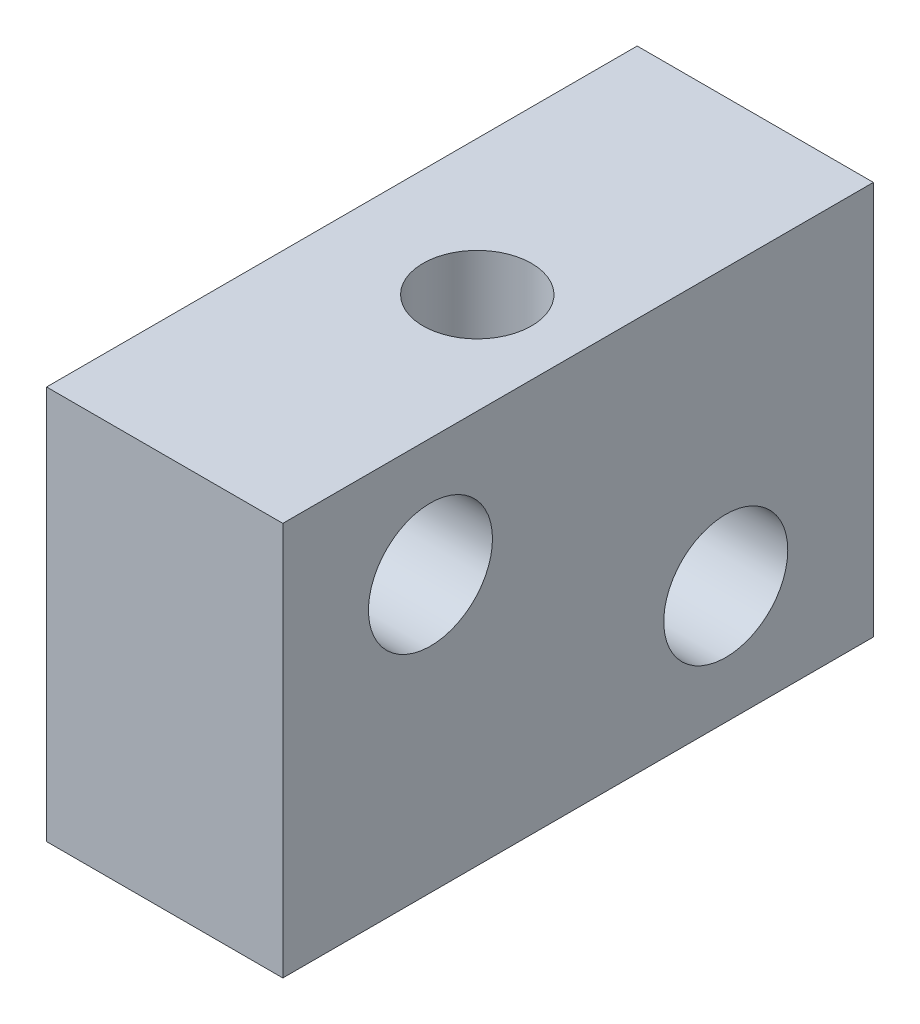
ISO-10303-21;
HEADER;
FILE_DESCRIPTION(('STEP AP214'),'2;1');
FILE_NAME('part.step','',(''),(''),'','','');
FILE_SCHEMA(('AUTOMOTIVE_DESIGN { 1 0 10303 214 1 1 1 1 }'));
ENDSEC;
DATA;
#1=APPLICATION_CONTEXT('core data for automotive mechanical design processes');
#2=APPLICATION_PROTOCOL_DEFINITION('international standard','automotive_design',2000,#1);
#3=PRODUCT_CONTEXT('',#1,'mechanical');
#4=PRODUCT('Part','Part','',(#3));
#5=PRODUCT_RELATED_PRODUCT_CATEGORY('part','',(#4));
#6=PRODUCT_DEFINITION_FORMATION('','',#4);
#7=PRODUCT_DEFINITION_CONTEXT('part definition',#1,'design');
#8=PRODUCT_DEFINITION('design','',#6,#7);
#9=PRODUCT_DEFINITION_SHAPE('','',#8);
#10=(LENGTH_UNIT() NAMED_UNIT(*) SI_UNIT(.MILLI.,.METRE.));
#11=(NAMED_UNIT(*) PLANE_ANGLE_UNIT() SI_UNIT($,.RADIAN.));
#12=(NAMED_UNIT(*) SI_UNIT($,.STERADIAN.) SOLID_ANGLE_UNIT());
#13=UNCERTAINTY_MEASURE_WITH_UNIT(LENGTH_MEASURE(1.E-05),#10,'distance_accuracy_value','');
#14=(GEOMETRIC_REPRESENTATION_CONTEXT(3) GLOBAL_UNCERTAINTY_ASSIGNED_CONTEXT((#13)) GLOBAL_UNIT_ASSIGNED_CONTEXT((#10,
#11,#12)) REPRESENTATION_CONTEXT('',''));
#15=CARTESIAN_POINT('',(0.,0.,0.));
#16=DIRECTION('',(0.,0.,1.));
#17=DIRECTION('',(1.,0.,0.));
#18=AXIS2_PLACEMENT_3D('',#15,#16,#17);
#19=CARTESIAN_POINT('',(7.62,-6.35,-9.525));
#20=DIRECTION('',(0.,1.,0.));
#21=DIRECTION('',(0.,0.,1.));
#22=AXIS2_PLACEMENT_3D('',#19,#20,#21);
#23=PLANE('',#22);
#24=CARTESIAN_POINT('',(4.36625,-6.35,0.));
#25=DIRECTION('',(0.,-1.,0.));
#26=DIRECTION('',(0.,0.,-1.));
#27=AXIS2_PLACEMENT_3D('',#24,#25,#26);
#28=CIRCLE('',#27,1.75);
#29=CARTESIAN_POINT('',(4.36625,-6.35,-1.75));
#30=VERTEX_POINT('',#29);
#31=EDGE_CURVE('E115',#30,#30,#28,.T.);
#32=ORIENTED_EDGE('',*,*,#31,.F.);
#33=EDGE_LOOP('',(#32));
#34=FACE_BOUND('',#33,.T.);
#35=DIRECTION('',(0.,0.,-1.));
#36=VECTOR('',#35,1.);
#37=CARTESIAN_POINT('',(0.,-6.35,-9.525));
#38=LINE('',#37,#36);
#39=CARTESIAN_POINT('',(0.,-6.35,9.525));
#40=VERTEX_POINT('',#39);
#41=CARTESIAN_POINT('',(0.,-6.35,-9.525));
#42=VERTEX_POINT('',#41);
#43=EDGE_CURVE('E105',#40,#42,#38,.T.);
#44=ORIENTED_EDGE('',*,*,#43,.T.);
#45=DIRECTION('',(-1.,0.,0.));
#46=VECTOR('',#45,1.);
#47=CARTESIAN_POINT('',(7.62,-6.35,-9.525));
#48=LINE('',#47,#46);
#49=CARTESIAN_POINT('',(7.62,-6.35,-9.525));
#50=VERTEX_POINT('',#49);
#51=EDGE_CURVE('E11',#50,#42,#48,.T.);
#52=ORIENTED_EDGE('',*,*,#51,.F.);
#53=DIRECTION('',(0.,0.,-1.));
#54=VECTOR('',#53,1.);
#55=CARTESIAN_POINT('',(7.62,-6.35,-9.525));
#56=LINE('',#55,#54);
#57=CARTESIAN_POINT('',(7.62,-6.35,9.525));
#58=VERTEX_POINT('',#57);
#59=EDGE_CURVE('E92',#58,#50,#56,.T.);
#60=ORIENTED_EDGE('',*,*,#59,.F.);
#61=DIRECTION('',(-1.,0.,0.));
#62=VECTOR('',#61,1.);
#63=CARTESIAN_POINT('',(7.62,-6.35,9.525));
#64=LINE('',#63,#62);
#65=EDGE_CURVE('E101',#58,#40,#64,.T.);
#66=ORIENTED_EDGE('',*,*,#65,.T.);
#67=EDGE_LOOP('',(#44,#52,#60,#66));
#68=FACE_BOUND('',#67,.T.);
#69=ADVANCED_FACE('F39',(#34,#68),#23,.F.);
#70=CARTESIAN_POINT('',(7.62,6.35,-9.525));
#71=DIRECTION('',(0.,0.,1.));
#72=DIRECTION('',(0.,-1.,0.));
#73=AXIS2_PLACEMENT_3D('',#70,#71,#72);
#74=PLANE('',#73);
#75=DIRECTION('',(0.,1.,0.));
#76=VECTOR('',#75,1.);
#77=CARTESIAN_POINT('',(0.,6.35,-9.525));
#78=LINE('',#77,#76);
#79=CARTESIAN_POINT('',(0.,6.35,-9.525));
#80=VERTEX_POINT('',#79);
#81=EDGE_CURVE('E96',#42,#80,#78,.T.);
#82=ORIENTED_EDGE('',*,*,#81,.T.);
#83=DIRECTION('',(-1.,0.,0.));
#84=VECTOR('',#83,1.);
#85=CARTESIAN_POINT('',(7.62,6.35,-9.525));
#86=LINE('',#85,#84);
#87=CARTESIAN_POINT('',(7.62,6.35,-9.525));
#88=VERTEX_POINT('',#87);
#89=EDGE_CURVE('E48',#88,#80,#86,.T.);
#90=ORIENTED_EDGE('',*,*,#89,.F.);
#91=DIRECTION('',(0.,1.,0.));
#92=VECTOR('',#91,1.);
#93=CARTESIAN_POINT('',(7.62,6.35,-9.525));
#94=LINE('',#93,#92);
#95=EDGE_CURVE('E87',#50,#88,#94,.T.);
#96=ORIENTED_EDGE('',*,*,#95,.F.);
#97=ORIENTED_EDGE('',*,*,#51,.T.);
#98=EDGE_LOOP('',(#82,#90,#96,#97));
#99=FACE_BOUND('',#98,.T.);
#100=ADVANCED_FACE('F95',(#99),#74,.F.);
#101=CARTESIAN_POINT('',(7.62,6.35,-9.525));
#102=DIRECTION('',(0.,-1.,0.));
#103=DIRECTION('',(0.,0.,-1.));
#104=AXIS2_PLACEMENT_3D('',#101,#102,#103);
#105=PLANE('',#104);
#106=CARTESIAN_POINT('',(4.36625,6.35,0.));
#107=DIRECTION('',(0.,-1.,0.));
#108=DIRECTION('',(0.,0.,-1.));
#109=AXIS2_PLACEMENT_3D('',#106,#107,#108);
#110=CIRCLE('',#109,1.75);
#111=CARTESIAN_POINT('',(4.36625,6.35,-1.75));
#112=VERTEX_POINT('',#111);
#113=EDGE_CURVE('E108',#112,#112,#110,.T.);
#114=ORIENTED_EDGE('',*,*,#113,.T.);
#115=EDGE_LOOP('',(#114));
#116=FACE_BOUND('',#115,.T.);
#117=DIRECTION('',(0.,0.,1.));
#118=VECTOR('',#117,1.);
#119=CARTESIAN_POINT('',(0.,6.35,-9.525));
#120=LINE('',#119,#118);
#121=CARTESIAN_POINT('',(0.,6.35,9.525));
#122=VERTEX_POINT('',#121);
#123=EDGE_CURVE('E74',#80,#122,#120,.T.);
#124=ORIENTED_EDGE('',*,*,#123,.T.);
#125=DIRECTION('',(-1.,0.,0.));
#126=VECTOR('',#125,1.);
#127=CARTESIAN_POINT('',(7.62,6.35,9.525));
#128=LINE('',#127,#126);
#129=CARTESIAN_POINT('',(7.62,6.35,9.525));
#130=VERTEX_POINT('',#129);
#131=EDGE_CURVE('E97',#130,#122,#128,.T.);
#132=ORIENTED_EDGE('',*,*,#131,.F.);
#133=DIRECTION('',(0.,0.,1.));
#134=VECTOR('',#133,1.);
#135=CARTESIAN_POINT('',(7.62,6.35,-9.525));
#136=LINE('',#135,#134);
#137=EDGE_CURVE('E90',#88,#130,#136,.T.);
#138=ORIENTED_EDGE('',*,*,#137,.F.);
#139=ORIENTED_EDGE('',*,*,#89,.T.);
#140=EDGE_LOOP('',(#124,#132,#138,#139));
#141=FACE_BOUND('',#140,.T.);
#142=ADVANCED_FACE('F99',(#116,#141),#105,.F.);
#143=CARTESIAN_POINT('',(7.62,6.35,9.525));
#144=DIRECTION('',(0.,0.,-1.));
#145=DIRECTION('',(-1.,0.,0.));
#146=AXIS2_PLACEMENT_3D('',#143,#144,#145);
#147=PLANE('',#146);
#148=DIRECTION('',(0.,-1.,0.));
#149=VECTOR('',#148,1.);
#150=CARTESIAN_POINT('',(0.,6.35,9.525));
#151=LINE('',#150,#149);
#152=EDGE_CURVE('E80',#122,#40,#151,.T.);
#153=ORIENTED_EDGE('',*,*,#152,.T.);
#154=ORIENTED_EDGE('',*,*,#65,.F.);
#155=DIRECTION('',(0.,-1.,0.));
#156=VECTOR('',#155,1.);
#157=CARTESIAN_POINT('',(7.62,6.35,9.525));
#158=LINE('',#157,#156);
#159=EDGE_CURVE('E57',#130,#58,#158,.T.);
#160=ORIENTED_EDGE('',*,*,#159,.F.);
#161=ORIENTED_EDGE('',*,*,#131,.T.);
#162=EDGE_LOOP('',(#153,#154,#160,#161));
#163=FACE_BOUND('',#162,.T.);
#164=ADVANCED_FACE('F151',(#163),#147,.F.);
#165=CARTESIAN_POINT('',(7.62,0.,0.));
#166=DIRECTION('',(1.,0.,0.));
#167=DIRECTION('',(0.,0.,-1.));
#168=AXIS2_PLACEMENT_3D('',#165,#166,#167);
#169=PLANE('',#168);
#170=CARTESIAN_POINT('',(7.62,-2.54,-4.7625));
#171=DIRECTION('',(1.,0.,0.));
#172=DIRECTION('',(0.,0.,-1.));
#173=AXIS2_PLACEMENT_3D('',#170,#171,#172);
#174=CIRCLE('',#173,2.);
#175=CARTESIAN_POINT('',(7.62,-2.54,-6.7625));
#176=VERTEX_POINT('',#175);
#177=EDGE_CURVE('E118',#176,#176,#174,.T.);
#178=ORIENTED_EDGE('',*,*,#177,.F.);
#179=EDGE_LOOP('',(#178));
#180=FACE_BOUND('',#179,.T.);
#181=CARTESIAN_POINT('',(7.62,2.54,4.7625));
#182=DIRECTION('',(1.,0.,0.));
#183=DIRECTION('',(0.,0.,-1.));
#184=AXIS2_PLACEMENT_3D('',#181,#182,#183);
#185=CIRCLE('',#184,2.);
#186=CARTESIAN_POINT('',(7.62,2.54,2.7625));
#187=VERTEX_POINT('',#186);
#188=EDGE_CURVE('E123',#187,#187,#185,.T.);
#189=ORIENTED_EDGE('',*,*,#188,.F.);
#190=EDGE_LOOP('',(#189));
#191=FACE_BOUND('',#190,.T.);
#192=ORIENTED_EDGE('',*,*,#59,.T.);
#193=ORIENTED_EDGE('',*,*,#95,.T.);
#194=ORIENTED_EDGE('',*,*,#137,.T.);
#195=ORIENTED_EDGE('',*,*,#159,.T.);
#196=EDGE_LOOP('',(#192,#193,#194,#195));
#197=FACE_BOUND('',#196,.T.);
#198=ADVANCED_FACE('F88',(#180,#191,#197),#169,.T.);
#199=CARTESIAN_POINT('',(0.,0.,0.));
#200=DIRECTION('',(1.,0.,0.));
#201=DIRECTION('',(0.,0.,-1.));
#202=AXIS2_PLACEMENT_3D('',#199,#200,#201);
#203=PLANE('',#202);
#204=CARTESIAN_POINT('',(0.,-2.54,-4.7625));
#205=DIRECTION('',(1.,0.,0.));
#206=DIRECTION('',(0.,0.,-1.));
#207=AXIS2_PLACEMENT_3D('',#204,#205,#206);
#208=CIRCLE('',#207,2.);
#209=CARTESIAN_POINT('',(0.,-2.54,-6.7625));
#210=VERTEX_POINT('',#209);
#211=EDGE_CURVE('E42',#210,#210,#208,.T.);
#212=ORIENTED_EDGE('',*,*,#211,.T.);
#213=EDGE_LOOP('',(#212));
#214=FACE_BOUND('',#213,.T.);
#215=CARTESIAN_POINT('',(0.,2.54,4.7625));
#216=DIRECTION('',(1.,0.,0.));
#217=DIRECTION('',(0.,0.,-1.));
#218=AXIS2_PLACEMENT_3D('',#215,#216,#217);
#219=CIRCLE('',#218,2.);
#220=CARTESIAN_POINT('',(0.,2.54,2.7625));
#221=VERTEX_POINT('',#220);
#222=EDGE_CURVE('E116',#221,#221,#219,.T.);
#223=ORIENTED_EDGE('',*,*,#222,.T.);
#224=EDGE_LOOP('',(#223));
#225=FACE_BOUND('',#224,.T.);
#226=ORIENTED_EDGE('',*,*,#43,.F.);
#227=ORIENTED_EDGE('',*,*,#152,.F.);
#228=ORIENTED_EDGE('',*,*,#123,.F.);
#229=ORIENTED_EDGE('',*,*,#81,.F.);
#230=EDGE_LOOP('',(#226,#227,#228,#229));
#231=FACE_BOUND('',#230,.T.);
#232=ADVANCED_FACE('F140',(#214,#225,#231),#203,.F.);
#233=CARTESIAN_POINT('',(4.36625,15.9385,0.));
#234=DIRECTION('',(0.,-1.,0.));
#235=DIRECTION('',(0.,0.,-1.));
#236=AXIS2_PLACEMENT_3D('',#233,#234,#235);
#237=CYLINDRICAL_SURFACE('',#236,1.75);
#238=ORIENTED_EDGE('',*,*,#31,.T.);
#239=EDGE_LOOP('',(#238));
#240=FACE_BOUND('',#239,.T.);
#241=ORIENTED_EDGE('',*,*,#113,.F.);
#242=EDGE_LOOP('',(#241));
#243=FACE_BOUND('',#242,.T.);
#244=ADVANCED_FACE('F133',(#240,#243),#237,.F.);
#245=CARTESIAN_POINT('',(-14.6685,2.54,4.7625));
#246=DIRECTION('',(1.,0.,0.));
#247=DIRECTION('',(0.,0.,-1.));
#248=AXIS2_PLACEMENT_3D('',#245,#246,#247);
#249=CYLINDRICAL_SURFACE('',#248,2.);
#250=ORIENTED_EDGE('',*,*,#188,.T.);
#251=EDGE_LOOP('',(#250));
#252=FACE_BOUND('',#251,.T.);
#253=ORIENTED_EDGE('',*,*,#222,.F.);
#254=EDGE_LOOP('',(#253));
#255=FACE_BOUND('',#254,.T.);
#256=ADVANCED_FACE('F149',(#252,#255),#249,.F.);
#257=CARTESIAN_POINT('',(-14.6685,-2.54,-4.7625));
#258=DIRECTION('',(1.,0.,0.));
#259=DIRECTION('',(0.,0.,-1.));
#260=AXIS2_PLACEMENT_3D('',#257,#258,#259);
#261=CYLINDRICAL_SURFACE('',#260,2.);
#262=ORIENTED_EDGE('',*,*,#177,.T.);
#263=EDGE_LOOP('',(#262));
#264=FACE_BOUND('',#263,.T.);
#265=ORIENTED_EDGE('',*,*,#211,.F.);
#266=EDGE_LOOP('',(#265));
#267=FACE_BOUND('',#266,.T.);
#268=ADVANCED_FACE('F200',(#264,#267),#261,.F.);
#269=CLOSED_SHELL('',(#69,#100,#142,#164,#198,#232,#244,#256,#268));
#270=MANIFOLD_SOLID_BREP('B2',#269);
#271=ADVANCED_BREP_SHAPE_REPRESENTATION('',(#18,#270),#14);
#272=SHAPE_DEFINITION_REPRESENTATION(#9,#271);
ENDSEC;
END-ISO-10303-21;
